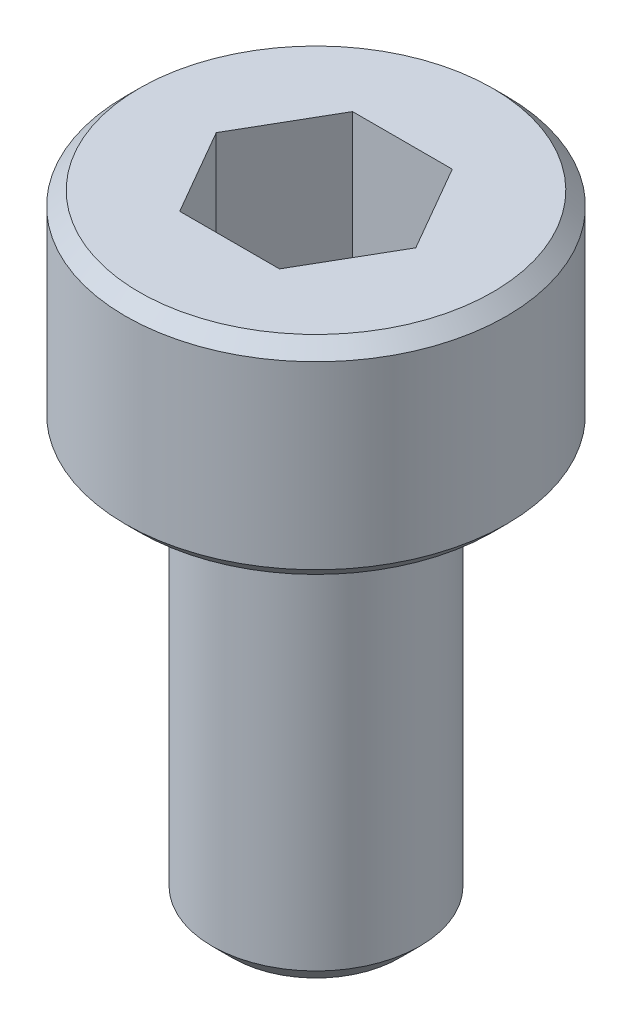
ISO-10303-21;
HEADER;
FILE_DESCRIPTION(('STEP AP214'),'2;1');
FILE_NAME('part.step','',(''),(''),'','','');
FILE_SCHEMA(('AUTOMOTIVE_DESIGN { 1 0 10303 214 1 1 1 1 }'));
ENDSEC;
DATA;
#1=APPLICATION_CONTEXT('core data for automotive mechanical design processes');
#2=APPLICATION_PROTOCOL_DEFINITION('international standard','automotive_design',2000,#1);
#3=PRODUCT_CONTEXT('',#1,'mechanical');
#4=PRODUCT('Part','Part','',(#3));
#5=PRODUCT_RELATED_PRODUCT_CATEGORY('part','',(#4));
#6=PRODUCT_DEFINITION_FORMATION('','',#4);
#7=PRODUCT_DEFINITION_CONTEXT('part definition',#1,'design');
#8=PRODUCT_DEFINITION('design','',#6,#7);
#9=PRODUCT_DEFINITION_SHAPE('','',#8);
#10=(LENGTH_UNIT() NAMED_UNIT(*) SI_UNIT(.MILLI.,.METRE.));
#11=(NAMED_UNIT(*) PLANE_ANGLE_UNIT() SI_UNIT($,.RADIAN.));
#12=(NAMED_UNIT(*) SI_UNIT($,.STERADIAN.) SOLID_ANGLE_UNIT());
#13=UNCERTAINTY_MEASURE_WITH_UNIT(LENGTH_MEASURE(1.E-05),#10,'distance_accuracy_value','');
#14=(GEOMETRIC_REPRESENTATION_CONTEXT(3) GLOBAL_UNCERTAINTY_ASSIGNED_CONTEXT((#13)) GLOBAL_UNIT_ASSIGNED_CONTEXT((#10,
#11,#12)) REPRESENTATION_CONTEXT('',''));
#15=CARTESIAN_POINT('',(0.,0.,0.));
#16=DIRECTION('',(0.,0.,1.));
#17=DIRECTION('',(1.,0.,0.));
#18=AXIS2_PLACEMENT_3D('',#15,#16,#17);
#19=CARTESIAN_POINT('',(1.5,-6.,0.));
#20=DIRECTION('',(0.,1.,0.));
#21=DIRECTION('',(0.,0.,1.));
#22=AXIS2_PLACEMENT_3D('',#19,#20,#21);
#23=PLANE('',#22);
#24=CARTESIAN_POINT('',(0.,-6.,0.));
#25=DIRECTION('',(0.,1.,0.));
#26=DIRECTION('',(0.,0.,1.));
#27=AXIS2_PLACEMENT_3D('',#24,#25,#26);
#28=CIRCLE('',#27,1.2);
#29=CARTESIAN_POINT('',(0.,-6.,1.2));
#30=VERTEX_POINT('',#29);
#31=EDGE_CURVE('E11',#30,#30,#28,.F.);
#32=ORIENTED_EDGE('',*,*,#31,.T.);
#33=EDGE_LOOP('',(#32));
#34=FACE_BOUND('',#33,.T.);
#35=ADVANCED_FACE('F41',(#34),#23,.F.);
#36=CARTESIAN_POINT('',(0.,3.,0.));
#37=DIRECTION('',(0.,1.,0.));
#38=DIRECTION('',(0.,0.,1.));
#39=AXIS2_PLACEMENT_3D('',#36,#37,#38);
#40=CYLINDRICAL_SURFACE('',#39,1.5);
#41=CARTESIAN_POINT('',(0.,-5.7,0.));
#42=DIRECTION('',(0.,1.,0.));
#43=DIRECTION('',(0.,0.,1.));
#44=AXIS2_PLACEMENT_3D('',#41,#42,#43);
#45=CIRCLE('',#44,1.5);
#46=CARTESIAN_POINT('',(0.,-5.7,1.5));
#47=VERTEX_POINT('',#46);
#48=EDGE_CURVE('E51',#47,#47,#45,.T.);
#49=ORIENTED_EDGE('',*,*,#48,.T.);
#50=EDGE_LOOP('',(#49));
#51=FACE_BOUND('',#50,.T.);
#52=CARTESIAN_POINT('',(0.,0.,0.));
#53=DIRECTION('',(0.,1.,0.));
#54=DIRECTION('',(0.,0.,1.));
#55=AXIS2_PLACEMENT_3D('',#52,#53,#54);
#56=CIRCLE('',#55,1.5);
#57=CARTESIAN_POINT('',(0.,0.,1.5));
#58=VERTEX_POINT('',#57);
#59=EDGE_CURVE('E157',#58,#58,#56,.T.);
#60=ORIENTED_EDGE('',*,*,#59,.F.);
#61=EDGE_LOOP('',(#60));
#62=FACE_BOUND('',#61,.T.);
#63=ADVANCED_FACE('F189',(#51,#62),#40,.T.);
#64=CARTESIAN_POINT('',(1.5,0.,0.));
#65=DIRECTION('',(0.,1.,0.));
#66=DIRECTION('',(0.,0.,1.));
#67=AXIS2_PLACEMENT_3D('',#64,#65,#66);
#68=PLANE('',#67);
#69=CARTESIAN_POINT('',(0.,0.,0.));
#70=DIRECTION('',(0.,1.,0.));
#71=DIRECTION('',(0.,0.,1.));
#72=AXIS2_PLACEMENT_3D('',#69,#70,#71);
#73=CIRCLE('',#72,2.55);
#74=CARTESIAN_POINT('',(0.,0.,2.55));
#75=VERTEX_POINT('',#74);
#76=EDGE_CURVE('E178',#75,#75,#73,.F.);
#77=ORIENTED_EDGE('',*,*,#76,.T.);
#78=EDGE_LOOP('',(#77));
#79=FACE_BOUND('',#78,.T.);
#80=ORIENTED_EDGE('',*,*,#59,.T.);
#81=EDGE_LOOP('',(#80));
#82=FACE_BOUND('',#81,.T.);
#83=ADVANCED_FACE('F211',(#79,#82),#68,.F.);
#84=CARTESIAN_POINT('',(0.,3.,0.));
#85=DIRECTION('',(0.,1.,0.));
#86=DIRECTION('',(0.,0.,1.));
#87=AXIS2_PLACEMENT_3D('',#84,#85,#86);
#88=CYLINDRICAL_SURFACE('',#87,2.75);
#89=CARTESIAN_POINT('',(0.,0.200000000000001,0.));
#90=DIRECTION('',(0.,1.,0.));
#91=DIRECTION('',(0.,0.,1.));
#92=AXIS2_PLACEMENT_3D('',#89,#90,#91);
#93=CIRCLE('',#92,2.75);
#94=CARTESIAN_POINT('',(0.,0.200000000000001,2.75));
#95=VERTEX_POINT('',#94);
#96=EDGE_CURVE('E174',#95,#95,#93,.T.);
#97=ORIENTED_EDGE('',*,*,#96,.T.);
#98=EDGE_LOOP('',(#97));
#99=FACE_BOUND('',#98,.T.);
#100=CARTESIAN_POINT('',(0.,2.8,0.));
#101=DIRECTION('',(0.,-1.,0.));
#102=DIRECTION('',(0.,0.,-1.));
#103=AXIS2_PLACEMENT_3D('',#100,#101,#102);
#104=CIRCLE('',#103,2.75);
#105=CARTESIAN_POINT('',(0.,2.8,-2.75));
#106=VERTEX_POINT('',#105);
#107=EDGE_CURVE('E170',#106,#106,#104,.T.);
#108=ORIENTED_EDGE('',*,*,#107,.T.);
#109=EDGE_LOOP('',(#108));
#110=FACE_BOUND('',#109,.T.);
#111=ADVANCED_FACE('F229',(#99,#110),#88,.T.);
#112=CARTESIAN_POINT('',(2.75,3.,0.));
#113=DIRECTION('',(0.,-1.,0.));
#114=DIRECTION('',(0.,0.,-1.));
#115=AXIS2_PLACEMENT_3D('',#112,#113,#114);
#116=PLANE('',#115);
#117=DIRECTION('',(0.5,0.,0.866025403784439));
#118=VECTOR('',#117,1.);
#119=CARTESIAN_POINT('',(-0.72,3.,1.24707658144959));
#120=LINE('',#119,#118);
#121=CARTESIAN_POINT('',(-1.44,3.,0.));
#122=VERTEX_POINT('',#121);
#123=CARTESIAN_POINT('',(-0.72,3.,1.24707658144959));
#124=VERTEX_POINT('',#123);
#125=EDGE_CURVE('E138',#122,#124,#120,.T.);
#126=ORIENTED_EDGE('',*,*,#125,.F.);
#127=DIRECTION('',(-0.5,0.,0.866025403784439));
#128=VECTOR('',#127,1.);
#129=CARTESIAN_POINT('',(-1.44,3.,0.));
#130=LINE('',#129,#128);
#131=CARTESIAN_POINT('',(-0.72,3.,-1.24707658144959));
#132=VERTEX_POINT('',#131);
#133=EDGE_CURVE('E58',#132,#122,#130,.T.);
#134=ORIENTED_EDGE('',*,*,#133,.F.);
#135=DIRECTION('',(-1.,0.,0.));
#136=VECTOR('',#135,1.);
#137=CARTESIAN_POINT('',(-0.72,3.,-1.24707658144959));
#138=LINE('',#137,#136);
#139=CARTESIAN_POINT('',(0.72,3.,-1.24707658144959));
#140=VERTEX_POINT('',#139);
#141=EDGE_CURVE('E151',#140,#132,#138,.T.);
#142=ORIENTED_EDGE('',*,*,#141,.F.);
#143=DIRECTION('',(-0.5,0.,-0.866025403784439));
#144=VECTOR('',#143,1.);
#145=CARTESIAN_POINT('',(0.72,3.,-1.24707658144959));
#146=LINE('',#145,#144);
#147=CARTESIAN_POINT('',(1.44,3.,0.));
#148=VERTEX_POINT('',#147);
#149=EDGE_CURVE('E148',#148,#140,#146,.T.);
#150=ORIENTED_EDGE('',*,*,#149,.F.);
#151=DIRECTION('',(0.5,0.,-0.866025403784439));
#152=VECTOR('',#151,1.);
#153=CARTESIAN_POINT('',(1.44,3.,0.));
#154=LINE('',#153,#152);
#155=CARTESIAN_POINT('',(0.72,3.,1.24707658144959));
#156=VERTEX_POINT('',#155);
#157=EDGE_CURVE('E106',#156,#148,#154,.T.);
#158=ORIENTED_EDGE('',*,*,#157,.F.);
#159=DIRECTION('',(1.,0.,0.));
#160=VECTOR('',#159,1.);
#161=CARTESIAN_POINT('',(0.72,3.,1.24707658144959));
#162=LINE('',#161,#160);
#163=EDGE_CURVE('E142',#124,#156,#162,.T.);
#164=ORIENTED_EDGE('',*,*,#163,.F.);
#165=EDGE_LOOP('',(#126,#134,#142,#150,#158,#164));
#166=FACE_BOUND('',#165,.T.);
#167=CARTESIAN_POINT('',(0.,3.,0.));
#168=DIRECTION('',(0.,-1.,0.));
#169=DIRECTION('',(0.,0.,-1.));
#170=AXIS2_PLACEMENT_3D('',#167,#168,#169);
#171=CIRCLE('',#170,2.55);
#172=CARTESIAN_POINT('',(0.,3.,-2.55));
#173=VERTEX_POINT('',#172);
#174=EDGE_CURVE('E182',#173,#173,#171,.F.);
#175=ORIENTED_EDGE('',*,*,#174,.T.);
#176=EDGE_LOOP('',(#175));
#177=FACE_BOUND('',#176,.T.);
#178=ADVANCED_FACE('F220',(#166,#177),#116,.F.);
#179=CARTESIAN_POINT('',(0.,0.200000000000001,0.));
#180=DIRECTION('',(0.,1.,0.));
#181=DIRECTION('',(0.,0.,1.));
#182=AXIS2_PLACEMENT_3D('',#179,#180,#181);
#183=CONICAL_SURFACE('',#182,2.75,0.78539816339745);
#184=ORIENTED_EDGE('',*,*,#76,.F.);
#185=EDGE_LOOP('',(#184));
#186=FACE_BOUND('',#185,.T.);
#187=ORIENTED_EDGE('',*,*,#96,.F.);
#188=EDGE_LOOP('',(#187));
#189=FACE_BOUND('',#188,.T.);
#190=ADVANCED_FACE('F202',(#186,#189),#183,.T.);
#191=CARTESIAN_POINT('',(0.,3.,0.));
#192=DIRECTION('',(0.,-1.,0.));
#193=DIRECTION('',(0.,0.,-1.));
#194=AXIS2_PLACEMENT_3D('',#191,#192,#193);
#195=CONICAL_SURFACE('',#194,2.55,0.785398163397446);
#196=ORIENTED_EDGE('',*,*,#107,.F.);
#197=EDGE_LOOP('',(#196));
#198=FACE_BOUND('',#197,.T.);
#199=ORIENTED_EDGE('',*,*,#174,.F.);
#200=EDGE_LOOP('',(#199));
#201=FACE_BOUND('',#200,.T.);
#202=ADVANCED_FACE('F194',(#198,#201),#195,.T.);
#203=CARTESIAN_POINT('',(0.,-5.7,0.));
#204=DIRECTION('',(0.,1.,0.));
#205=DIRECTION('',(0.,0.,1.));
#206=AXIS2_PLACEMENT_3D('',#203,#204,#205);
#207=CONICAL_SURFACE('',#206,1.5,0.785398163397446);
#208=ORIENTED_EDGE('',*,*,#31,.F.);
#209=EDGE_LOOP('',(#208));
#210=FACE_BOUND('',#209,.T.);
#211=ORIENTED_EDGE('',*,*,#48,.F.);
#212=EDGE_LOOP('',(#211));
#213=FACE_BOUND('',#212,.T.);
#214=ADVANCED_FACE('F44',(#210,#213),#207,.T.);
#215=CARTESIAN_POINT('',(-1.44,0.5,0.));
#216=DIRECTION('',(-0.866025403784439,0.,-0.5));
#217=DIRECTION('',(-0.5,0.,0.866025403784439));
#218=AXIS2_PLACEMENT_3D('',#215,#216,#217);
#219=PLANE('',#218);
#220=ORIENTED_EDGE('',*,*,#133,.T.);
#221=DIRECTION('',(0.,1.,0.));
#222=VECTOR('',#221,1.);
#223=CARTESIAN_POINT('',(-1.44,0.5,0.));
#224=LINE('',#223,#222);
#225=CARTESIAN_POINT('',(-1.44,0.5,0.));
#226=VERTEX_POINT('',#225);
#227=EDGE_CURVE('E88',#226,#122,#224,.T.);
#228=ORIENTED_EDGE('',*,*,#227,.F.);
#229=DIRECTION('',(-0.5,0.,0.866025403784439));
#230=VECTOR('',#229,1.);
#231=CARTESIAN_POINT('',(-1.44,0.5,0.));
#232=LINE('',#231,#230);
#233=CARTESIAN_POINT('',(-0.72,0.5,-1.24707658144959));
#234=VERTEX_POINT('',#233);
#235=EDGE_CURVE('E154',#234,#226,#232,.T.);
#236=ORIENTED_EDGE('',*,*,#235,.F.);
#237=DIRECTION('',(0.,1.,0.));
#238=VECTOR('',#237,1.);
#239=CARTESIAN_POINT('',(-0.72,0.5,-1.24707658144959));
#240=LINE('',#239,#238);
#241=EDGE_CURVE('E66',#234,#132,#240,.T.);
#242=ORIENTED_EDGE('',*,*,#241,.T.);
#243=EDGE_LOOP('',(#220,#228,#236,#242));
#244=FACE_BOUND('',#243,.T.);
#245=ADVANCED_FACE('F193',(#244),#219,.F.);
#246=CARTESIAN_POINT('',(-0.72,0.5,-1.24707658144959));
#247=DIRECTION('',(0.,0.,-1.));
#248=DIRECTION('',(-1.,0.,0.));
#249=AXIS2_PLACEMENT_3D('',#246,#247,#248);
#250=PLANE('',#249);
#251=ORIENTED_EDGE('',*,*,#141,.T.);
#252=ORIENTED_EDGE('',*,*,#241,.F.);
#253=DIRECTION('',(-1.,0.,0.));
#254=VECTOR('',#253,1.);
#255=CARTESIAN_POINT('',(-0.72,0.5,-1.24707658144959));
#256=LINE('',#255,#254);
#257=CARTESIAN_POINT('',(0.72,0.5,-1.24707658144959));
#258=VERTEX_POINT('',#257);
#259=EDGE_CURVE('E120',#258,#234,#256,.T.);
#260=ORIENTED_EDGE('',*,*,#259,.F.);
#261=DIRECTION('',(0.,1.,0.));
#262=VECTOR('',#261,1.);
#263=CARTESIAN_POINT('',(0.72,0.5,-1.24707658144959));
#264=LINE('',#263,#262);
#265=EDGE_CURVE('E111',#258,#140,#264,.T.);
#266=ORIENTED_EDGE('',*,*,#265,.T.);
#267=EDGE_LOOP('',(#251,#252,#260,#266));
#268=FACE_BOUND('',#267,.T.);
#269=ADVANCED_FACE('F200',(#268),#250,.F.);
#270=CARTESIAN_POINT('',(0.72,0.5,-1.24707658144959));
#271=DIRECTION('',(0.866025403784439,0.,-0.5));
#272=DIRECTION('',(-0.5,0.,-0.866025403784439));
#273=AXIS2_PLACEMENT_3D('',#270,#271,#272);
#274=PLANE('',#273);
#275=ORIENTED_EDGE('',*,*,#149,.T.);
#276=ORIENTED_EDGE('',*,*,#265,.F.);
#277=DIRECTION('',(-0.5,0.,-0.866025403784439));
#278=VECTOR('',#277,1.);
#279=CARTESIAN_POINT('',(0.72,0.5,-1.24707658144959));
#280=LINE('',#279,#278);
#281=CARTESIAN_POINT('',(1.44,0.5,0.));
#282=VERTEX_POINT('',#281);
#283=EDGE_CURVE('E115',#282,#258,#280,.T.);
#284=ORIENTED_EDGE('',*,*,#283,.F.);
#285=DIRECTION('',(0.,1.,0.));
#286=VECTOR('',#285,1.);
#287=CARTESIAN_POINT('',(1.44,0.5,0.));
#288=LINE('',#287,#286);
#289=EDGE_CURVE('E99',#282,#148,#288,.T.);
#290=ORIENTED_EDGE('',*,*,#289,.T.);
#291=EDGE_LOOP('',(#275,#276,#284,#290));
#292=FACE_BOUND('',#291,.T.);
#293=ADVANCED_FACE('F116',(#292),#274,.F.);
#294=CARTESIAN_POINT('',(1.44,0.5,0.));
#295=DIRECTION('',(0.866025403784439,0.,0.5));
#296=DIRECTION('',(0.5,0.,-0.866025403784439));
#297=AXIS2_PLACEMENT_3D('',#294,#295,#296);
#298=PLANE('',#297);
#299=ORIENTED_EDGE('',*,*,#157,.T.);
#300=ORIENTED_EDGE('',*,*,#289,.F.);
#301=DIRECTION('',(0.5,0.,-0.866025403784439));
#302=VECTOR('',#301,1.);
#303=CARTESIAN_POINT('',(1.44,0.5,0.));
#304=LINE('',#303,#302);
#305=CARTESIAN_POINT('',(0.72,0.5,1.24707658144959));
#306=VERTEX_POINT('',#305);
#307=EDGE_CURVE('E103',#306,#282,#304,.T.);
#308=ORIENTED_EDGE('',*,*,#307,.F.);
#309=DIRECTION('',(0.,1.,0.));
#310=VECTOR('',#309,1.);
#311=CARTESIAN_POINT('',(0.72,0.5,1.24707658144959));
#312=LINE('',#311,#310);
#313=EDGE_CURVE('E112',#306,#156,#312,.T.);
#314=ORIENTED_EDGE('',*,*,#313,.T.);
#315=EDGE_LOOP('',(#299,#300,#308,#314));
#316=FACE_BOUND('',#315,.T.);
#317=ADVANCED_FACE('F101',(#316),#298,.F.);
#318=CARTESIAN_POINT('',(0.72,0.5,1.24707658144959));
#319=DIRECTION('',(0.,0.,1.));
#320=DIRECTION('',(1.,0.,0.));
#321=AXIS2_PLACEMENT_3D('',#318,#319,#320);
#322=PLANE('',#321);
#323=ORIENTED_EDGE('',*,*,#163,.T.);
#324=ORIENTED_EDGE('',*,*,#313,.F.);
#325=DIRECTION('',(1.,0.,0.));
#326=VECTOR('',#325,1.);
#327=CARTESIAN_POINT('',(0.72,0.5,1.24707658144959));
#328=LINE('',#327,#326);
#329=CARTESIAN_POINT('',(-0.72,0.5,1.24707658144959));
#330=VERTEX_POINT('',#329);
#331=EDGE_CURVE('E126',#330,#306,#328,.T.);
#332=ORIENTED_EDGE('',*,*,#331,.F.);
#333=DIRECTION('',(0.,1.,0.));
#334=VECTOR('',#333,1.);
#335=CARTESIAN_POINT('',(-0.72,0.5,1.24707658144959));
#336=LINE('',#335,#334);
#337=EDGE_CURVE('E162',#330,#124,#336,.T.);
#338=ORIENTED_EDGE('',*,*,#337,.T.);
#339=EDGE_LOOP('',(#323,#324,#332,#338));
#340=FACE_BOUND('',#339,.T.);
#341=ADVANCED_FACE('F251',(#340),#322,.F.);
#342=CARTESIAN_POINT('',(-0.72,0.5,1.24707658144959));
#343=DIRECTION('',(-0.866025403784439,0.,0.5));
#344=DIRECTION('',(0.5,0.,0.866025403784439));
#345=AXIS2_PLACEMENT_3D('',#342,#343,#344);
#346=PLANE('',#345);
#347=ORIENTED_EDGE('',*,*,#125,.T.);
#348=ORIENTED_EDGE('',*,*,#337,.F.);
#349=DIRECTION('',(0.5,0.,0.866025403784439));
#350=VECTOR('',#349,1.);
#351=CARTESIAN_POINT('',(-0.72,0.5,1.24707658144959));
#352=LINE('',#351,#350);
#353=EDGE_CURVE('E130',#226,#330,#352,.T.);
#354=ORIENTED_EDGE('',*,*,#353,.F.);
#355=ORIENTED_EDGE('',*,*,#227,.T.);
#356=EDGE_LOOP('',(#347,#348,#354,#355));
#357=FACE_BOUND('',#356,.T.);
#358=ADVANCED_FACE('F248',(#357),#346,.F.);
#359=CARTESIAN_POINT('',(0.,0.5,0.));
#360=DIRECTION('',(0.,-1.,0.));
#361=DIRECTION('',(0.,0.,-1.));
#362=AXIS2_PLACEMENT_3D('',#359,#360,#361);
#363=PLANE('',#362);
#364=ORIENTED_EDGE('',*,*,#235,.T.);
#365=ORIENTED_EDGE('',*,*,#353,.T.);
#366=ORIENTED_EDGE('',*,*,#331,.T.);
#367=ORIENTED_EDGE('',*,*,#307,.T.);
#368=ORIENTED_EDGE('',*,*,#283,.T.);
#369=ORIENTED_EDGE('',*,*,#259,.T.);
#370=EDGE_LOOP('',(#364,#365,#366,#367,#368,#369));
#371=FACE_BOUND('',#370,.T.);
#372=ADVANCED_FACE('F123',(#371),#363,.F.);
#373=CLOSED_SHELL('',(#35,#63,#83,#111,#178,#190,#202,#214,#245,#269,#293,#317,#341,#358,#372));
#374=MANIFOLD_SOLID_BREP('B2',#373);
#375=ADVANCED_BREP_SHAPE_REPRESENTATION('',(#18,#374),#14);
#376=SHAPE_DEFINITION_REPRESENTATION(#9,#375);
ENDSEC;
END-ISO-10303-21;
